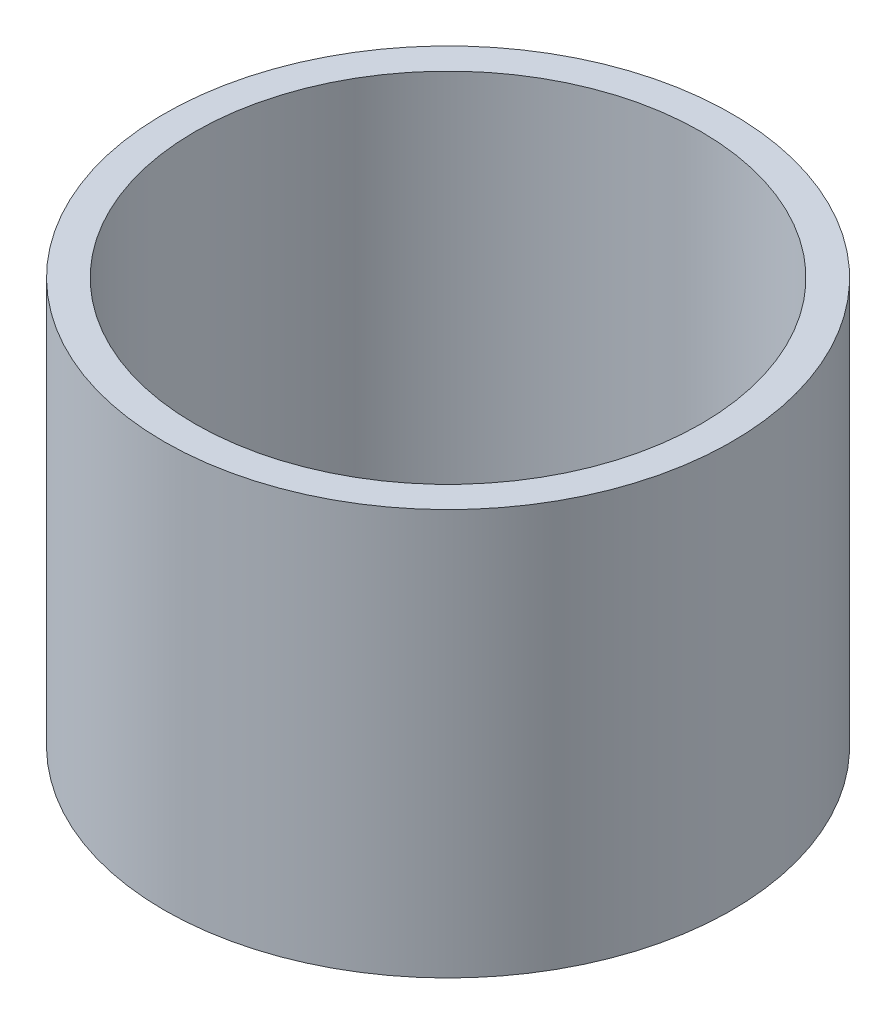
ISO-10303-21;
HEADER;
FILE_DESCRIPTION(('STEP AP214'),'2;1');
FILE_NAME('part.step','',(''),(''),'','','');
FILE_SCHEMA(('AUTOMOTIVE_DESIGN { 1 0 10303 214 1 1 1 1 }'));
ENDSEC;
DATA;
#1=APPLICATION_CONTEXT('core data for automotive mechanical design processes');
#2=APPLICATION_PROTOCOL_DEFINITION('international standard','automotive_design',2000,#1);
#3=PRODUCT_CONTEXT('',#1,'mechanical');
#4=PRODUCT('Part','Part','',(#3));
#5=PRODUCT_RELATED_PRODUCT_CATEGORY('part','',(#4));
#6=PRODUCT_DEFINITION_FORMATION('','',#4);
#7=PRODUCT_DEFINITION_CONTEXT('part definition',#1,'design');
#8=PRODUCT_DEFINITION('design','',#6,#7);
#9=PRODUCT_DEFINITION_SHAPE('','',#8);
#10=(LENGTH_UNIT() NAMED_UNIT(*) SI_UNIT(.MILLI.,.METRE.));
#11=(NAMED_UNIT(*) PLANE_ANGLE_UNIT() SI_UNIT($,.RADIAN.));
#12=(NAMED_UNIT(*) SI_UNIT($,.STERADIAN.) SOLID_ANGLE_UNIT());
#13=UNCERTAINTY_MEASURE_WITH_UNIT(LENGTH_MEASURE(1.E-05),#10,'distance_accuracy_value','');
#14=(GEOMETRIC_REPRESENTATION_CONTEXT(3) GLOBAL_UNCERTAINTY_ASSIGNED_CONTEXT((#13)) GLOBAL_UNIT_ASSIGNED_CONTEXT((#10,
#11,#12)) REPRESENTATION_CONTEXT('',''));
#15=CARTESIAN_POINT('',(0.,0.,0.));
#16=DIRECTION('',(0.,0.,1.));
#17=DIRECTION('',(1.,0.,0.));
#18=AXIS2_PLACEMENT_3D('',#15,#16,#17);
#19=CARTESIAN_POINT('',(0.,20.,0.));
#20=DIRECTION('',(0.,1.,0.));
#21=DIRECTION('',(0.,0.,1.));
#22=AXIS2_PLACEMENT_3D('',#19,#20,#21);
#23=PLANE('',#22);
#24=CARTESIAN_POINT('',(0.,20.,0.));
#25=DIRECTION('',(0.,1.,0.));
#26=DIRECTION('',(0.,0.,1.));
#27=AXIS2_PLACEMENT_3D('',#24,#25,#26);
#28=CIRCLE('',#27,14.);
#29=CARTESIAN_POINT('',(0.,20.,14.));
#30=VERTEX_POINT('',#29);
#31=EDGE_CURVE('E10',#30,#30,#28,.T.);
#32=ORIENTED_EDGE('',*,*,#31,.T.);
#33=EDGE_LOOP('',(#32));
#34=FACE_BOUND('',#33,.T.);
#35=CARTESIAN_POINT('',(0.,20.,0.));
#36=DIRECTION('',(0.,1.,0.));
#37=DIRECTION('',(0.,0.,1.));
#38=AXIS2_PLACEMENT_3D('',#35,#36,#37);
#39=CIRCLE('',#38,12.4777072679345);
#40=CARTESIAN_POINT('',(0.,20.,12.4777072679345));
#41=VERTEX_POINT('',#40);
#42=EDGE_CURVE('E42',#41,#41,#39,.T.);
#43=ORIENTED_EDGE('',*,*,#42,.F.);
#44=EDGE_LOOP('',(#43));
#45=FACE_BOUND('',#44,.T.);
#46=ADVANCED_FACE('F31',(#34,#45),#23,.T.);
#47=CARTESIAN_POINT('',(0.,0.,0.));
#48=DIRECTION('',(0.,1.,0.));
#49=DIRECTION('',(0.,0.,1.));
#50=AXIS2_PLACEMENT_3D('',#47,#48,#49);
#51=PLANE('',#50);
#52=CARTESIAN_POINT('',(0.,0.,0.));
#53=DIRECTION('',(0.,1.,0.));
#54=DIRECTION('',(0.,0.,1.));
#55=AXIS2_PLACEMENT_3D('',#52,#53,#54);
#56=CIRCLE('',#55,14.);
#57=CARTESIAN_POINT('',(0.,0.,14.));
#58=VERTEX_POINT('',#57);
#59=EDGE_CURVE('E35',#58,#58,#56,.T.);
#60=ORIENTED_EDGE('',*,*,#59,.F.);
#61=EDGE_LOOP('',(#60));
#62=FACE_BOUND('',#61,.T.);
#63=CARTESIAN_POINT('',(0.,0.,0.));
#64=DIRECTION('',(0.,1.,0.));
#65=DIRECTION('',(0.,0.,1.));
#66=AXIS2_PLACEMENT_3D('',#63,#64,#65);
#67=CIRCLE('',#66,12.4777072679345);
#68=CARTESIAN_POINT('',(0.,0.,12.4777072679345));
#69=VERTEX_POINT('',#68);
#70=EDGE_CURVE('E44',#69,#69,#67,.T.);
#71=ORIENTED_EDGE('',*,*,#70,.T.);
#72=EDGE_LOOP('',(#71));
#73=FACE_BOUND('',#72,.T.);
#74=ADVANCED_FACE('F54',(#62,#73),#51,.F.);
#75=CARTESIAN_POINT('',(0.,20.,0.));
#76=DIRECTION('',(0.,-1.,0.));
#77=DIRECTION('',(0.,0.,-1.));
#78=AXIS2_PLACEMENT_3D('',#75,#76,#77);
#79=CYLINDRICAL_SURFACE('',#78,14.);
#80=ORIENTED_EDGE('',*,*,#31,.F.);
#81=EDGE_LOOP('',(#80));
#82=FACE_BOUND('',#81,.T.);
#83=ORIENTED_EDGE('',*,*,#59,.T.);
#84=EDGE_LOOP('',(#83));
#85=FACE_BOUND('',#84,.T.);
#86=ADVANCED_FACE('F33',(#82,#85),#79,.T.);
#87=CARTESIAN_POINT('',(0.,20.,0.));
#88=DIRECTION('',(0.,-1.,0.));
#89=DIRECTION('',(0.,0.,-1.));
#90=AXIS2_PLACEMENT_3D('',#87,#88,#89);
#91=CYLINDRICAL_SURFACE('',#90,12.4777072679345);
#92=ORIENTED_EDGE('',*,*,#42,.T.);
#93=EDGE_LOOP('',(#92));
#94=FACE_BOUND('',#93,.T.);
#95=ORIENTED_EDGE('',*,*,#70,.F.);
#96=EDGE_LOOP('',(#95));
#97=FACE_BOUND('',#96,.T.);
#98=ADVANCED_FACE('F50',(#94,#97),#91,.F.);
#99=CLOSED_SHELL('',(#46,#74,#86,#98));
#100=MANIFOLD_SOLID_BREP('B2',#99);
#101=ADVANCED_BREP_SHAPE_REPRESENTATION('',(#18,#100),#14);
#102=SHAPE_DEFINITION_REPRESENTATION(#9,#101);
ENDSEC;
END-ISO-10303-21;
